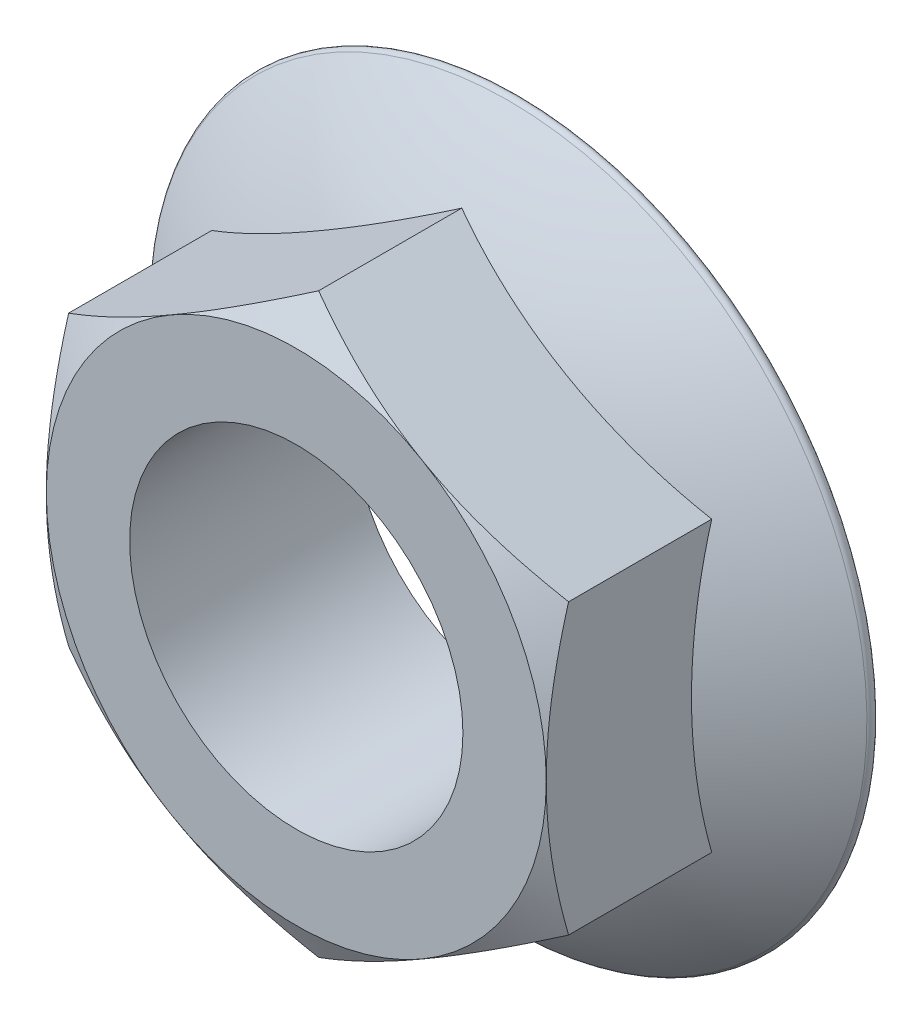
ISO-10303-21;
HEADER;
FILE_DESCRIPTION(('STEP AP214'),'2;1');
FILE_NAME('part.step','',(''),(''),'','','');
FILE_SCHEMA(('AUTOMOTIVE_DESIGN { 1 0 10303 214 1 1 1 1 }'));
ENDSEC;
DATA;
#1=APPLICATION_CONTEXT('core data for automotive mechanical design processes');
#2=APPLICATION_PROTOCOL_DEFINITION('international standard','automotive_design',2000,#1);
#3=PRODUCT_CONTEXT('',#1,'mechanical');
#4=PRODUCT('Part','Part','',(#3));
#5=PRODUCT_RELATED_PRODUCT_CATEGORY('part','',(#4));
#6=PRODUCT_DEFINITION_FORMATION('','',#4);
#7=PRODUCT_DEFINITION_CONTEXT('part definition',#1,'design');
#8=PRODUCT_DEFINITION('design','',#6,#7);
#9=PRODUCT_DEFINITION_SHAPE('','',#8);
#10=(LENGTH_UNIT() NAMED_UNIT(*) SI_UNIT(.MILLI.,.METRE.));
#11=(NAMED_UNIT(*) PLANE_ANGLE_UNIT() SI_UNIT($,.RADIAN.));
#12=(NAMED_UNIT(*) SI_UNIT($,.STERADIAN.) SOLID_ANGLE_UNIT());
#13=UNCERTAINTY_MEASURE_WITH_UNIT(LENGTH_MEASURE(1.E-05),#10,'distance_accuracy_value','');
#14=(GEOMETRIC_REPRESENTATION_CONTEXT(3) GLOBAL_UNCERTAINTY_ASSIGNED_CONTEXT((#13)) GLOBAL_UNIT_ASSIGNED_CONTEXT((#10,
#11,#12)) REPRESENTATION_CONTEXT('',''));
#15=CARTESIAN_POINT('',(0.,0.,0.));
#16=DIRECTION('',(0.,0.,1.));
#17=DIRECTION('',(1.,0.,0.));
#18=AXIS2_PLACEMENT_3D('',#15,#16,#17);
#19=CARTESIAN_POINT('',(0.,25.9807621135332,20.));
#20=DIRECTION('',(0.5,-0.866025403784439,0.));
#21=DIRECTION('',(0.866025403784439,0.5,0.));
#22=AXIS2_PLACEMENT_3D('',#19,#20,#21);
#23=PLANE('',#22);
#24=CARTESIAN_POINT('',(0.000199999999998479,25.980877583587,17.9903143896555));
#25=CARTESIAN_POINT('',(-0.494340315320358,25.6953545994117,18.1551492707593));
#26=CARTESIAN_POINT('',(-0.990809601239479,25.4087179235419,18.3125041584607));
#27=CARTESIAN_POINT('',(-1.98772926208786,24.8331460889906,18.6101747825265));
#28=CARTESIAN_POINT('',(-2.48818088905229,24.5442102074463,18.7504849147612));
#29=CARTESIAN_POINT('',(-3.49404310444017,23.9634753866245,19.0121827394148));
#30=CARTESIAN_POINT('',(-3.99946257540048,23.6716713190119,19.1335252438812));
#31=CARTESIAN_POINT('',(-5.01379199131474,23.0860479576868,19.3546738156916));
#32=CARTESIAN_POINT('',(-5.52270158333677,22.7922288677397,19.4544820284597));
#33=CARTESIAN_POINT('',(-6.53100308542397,22.2100857240854,19.6283253044473));
#34=CARTESIAN_POINT('',(-7.03032020450329,21.9218048509739,19.7029352669185));
#35=CARTESIAN_POINT('',(-8.03124235456725,21.3439221781966,19.8280391846674));
#36=CARTESIAN_POINT('',(-8.53284742940407,21.0543203532127,19.8785326757383));
#37=CARTESIAN_POINT('',(-9.53690018234172,20.4746302260236,19.954128715289));
#38=CARTESIAN_POINT('',(-10.0393461451645,20.1845429141346,19.9792614354897));
#39=CARTESIAN_POINT('',(-11.0447017408546,19.6041005903316,20.0035954599864));
#40=CARTESIAN_POINT('',(-11.5476113589139,19.313745586967,20.0027975655861));
#41=CARTESIAN_POINT('',(-12.4878094832121,18.7709219468119,19.9770814657185));
#42=CARTESIAN_POINT('',(-12.9251649504396,18.5184146500766,19.9552991118006));
#43=CARTESIAN_POINT('',(-13.7988317564138,18.0140028844653,19.892536574804));
#44=CARTESIAN_POINT('',(-14.2351431100254,17.7620984070071,19.8515566666916));
#45=CARTESIAN_POINT('',(-15.1065604849226,17.2589853510337,19.7511092481865));
#46=CARTESIAN_POINT('',(-15.5416650558499,17.0077776098832,19.6916250199366));
#47=CARTESIAN_POINT('',(-16.4097908378745,16.5065649559409,19.5552217340813));
#48=CARTESIAN_POINT('',(-16.842812057791,16.2565600380572,19.4783027503465));
#49=CARTESIAN_POINT('',(-18.1573722886485,15.4975983349057,19.2194196562896));
#50=CARTESIAN_POINT('',(-19.0351763947766,14.9907978979369,19.011627893702));
#51=CARTESIAN_POINT('',(-20.3421885092524,14.2361941018102,18.6578721503226));
#52=CARTESIAN_POINT('',(-20.7758690162324,13.985808544363,18.5330695175296));
#53=CARTESIAN_POINT('',(-21.6402303188989,13.4867693135914,18.2708295210671));
#54=CARTESIAN_POINT('',(-22.0709119234591,13.2381151732635,18.1333957185273));
#55=CARTESIAN_POINT('',(-22.5002,12.9902655867127,17.9903143896555));
#56=B_SPLINE_CURVE_WITH_KNOTS('',3,(#24,#25,#26,#27,#28,#29,#30,#31,#32,#33,#34,#35,#36,#37,#38,
#39,#40,#41,#42,#43,#44,#45,#46,#47,#48,#49,#50,#51,#52,#53,#54,#55),.UNSPECIFIED.,.F.,.F.,(4,2,
2,2,2,2,2,2,2,2,2,2,2,2,2,4),(0.,1.78312722203929,3.56683913913434,5.35473780165091,
7.14245825659312,8.88609109738608,10.6297574992032,12.3713470058018,14.1128826941264,
15.6289689473497,17.1450334863602,18.6624717220614,20.1799035285482,23.281607613878,
24.8297579454588,26.3774731352151),.UNSPECIFIED.);
#57=CARTESIAN_POINT('',(0.,25.9807621135332,17.9903810567666));
#58=VERTEX_POINT('',#57);
#59=CARTESIAN_POINT('',(-11.25,19.4855715851499,20.));
#60=VERTEX_POINT('',#59);
#61=EDGE_CURVE('E108',#58,#60,#56,.T.);
#62=ORIENTED_EDGE('',*,*,#61,.F.);
#63=DIRECTION('',(0.,0.,-1.));
#64=VECTOR('',#63,1.);
#65=CARTESIAN_POINT('',(0.,25.9807621135332,20.));
#66=LINE('',#65,#64);
#67=CARTESIAN_POINT('',(0.,25.9807621135332,5.10562126709525));
#68=VERTEX_POINT('',#67);
#69=EDGE_CURVE('E398',#58,#68,#66,.T.);
#70=ORIENTED_EDGE('',*,*,#69,.T.);
#71=CARTESIAN_POINT('',(-11.25,19.4855715851499,-40.4001136363637));
#72=DIRECTION('',(0.5,-0.866025403784439,0.));
#73=DIRECTION('',(0.866025403784439,0.5,0.));
#74=AXIS2_PLACEMENT_3D('',#71,#72,#73);
#75=CIRCLE('',#74,47.3235872383305);
#76=CARTESIAN_POINT('',(-22.5,12.9903810567666,5.10562126709525));
#77=VERTEX_POINT('',#76);
#78=EDGE_CURVE('E396',#77,#68,#75,.F.);
#79=ORIENTED_EDGE('',*,*,#78,.F.);
#80=DIRECTION('',(0.,0.,-1.));
#81=VECTOR('',#80,1.);
#82=CARTESIAN_POINT('',(-22.5,12.9903810567666,20.));
#83=LINE('',#82,#81);
#84=CARTESIAN_POINT('',(-22.5,12.9903810567666,17.9903810567666));
#85=VERTEX_POINT('',#84);
#86=EDGE_CURVE('E131',#85,#77,#83,.T.);
#87=ORIENTED_EDGE('',*,*,#86,.F.);
#88=EDGE_CURVE('E117',#60,#85,#56,.T.);
#89=ORIENTED_EDGE('',*,*,#88,.F.);
#90=EDGE_LOOP('',(#62,#70,#79,#87,#89));
#91=FACE_BOUND('',#90,.T.);
#92=ADVANCED_FACE('F38',(#91),#23,.F.);
#93=CARTESIAN_POINT('',(-22.5,12.9903810567666,20.));
#94=DIRECTION('',(1.,0.,0.));
#95=DIRECTION('',(0.,0.,-1.));
#96=AXIS2_PLACEMENT_3D('',#93,#94,#95);
#97=PLANE('',#96);
#98=CARTESIAN_POINT('',(-22.5,42.937910116955,5.00279973211657));
#99=CARTESIAN_POINT('',(-22.5,42.4349867908762,5.25998830996277));
#100=CARTESIAN_POINT('',(-22.5,41.9316712448641,5.51640961946833));
#101=CARTESIAN_POINT('',(-22.5,40.9241808993457,6.02756274502809));
#102=CARTESIAN_POINT('',(-22.5,40.4200060968718,6.28229455523246));
#103=CARTESIAN_POINT('',(-22.5,38.906067399752,7.04372989587429));
#104=CARTESIAN_POINT('',(-22.5,37.8949075563432,7.54766394292194));
#105=CARTESIAN_POINT('',(-22.5,35.8664336922577,8.54744404798992));
#106=CARTESIAN_POINT('',(-22.5,34.849112085713,9.04327473279686));
#107=CARTESIAN_POINT('',(-22.5,32.8091562949487,10.0239453406089));
#108=CARTESIAN_POINT('',(-22.5,31.7865220333206,10.5087851029147));
#109=CARTESIAN_POINT('',(-22.5,29.6826836887022,11.489168716423));
#110=CARTESIAN_POINT('',(-22.5,28.6011475492797,11.9840015357758));
#111=CARTESIAN_POINT('',(-22.5,26.4295684611349,12.9545883452375));
#112=CARTESIAN_POINT('',(-22.5,25.3395259663007,13.4303433451106));
#113=CARTESIAN_POINT('',(-22.5,23.6970388665296,14.1254074700941));
#114=CARTESIAN_POINT('',(-22.5,23.1484886270678,14.3539282550564));
#115=CARTESIAN_POINT('',(-22.5,22.0485270558716,14.8039685587357));
#116=CARTESIAN_POINT('',(-22.5,21.4971157654287,15.0254881781701));
#117=CARTESIAN_POINT('',(-22.5,20.3909977243873,15.4606074265542));
#118=CARTESIAN_POINT('',(-22.5,19.8362901159974,15.6742048789127));
#119=CARTESIAN_POINT('',(-22.5,18.7234476974617,16.0922649956442));
#120=CARTESIAN_POINT('',(-22.5,18.1653129401696,16.2967278004915));
#121=CARTESIAN_POINT('',(-22.5,16.9449865841485,16.7309016542748));
#122=CARTESIAN_POINT('',(-22.5,16.2820662225517,16.9585738291773));
#123=CARTESIAN_POINT('',(-22.5,14.9505731173334,17.3968937659042));
#124=CARTESIAN_POINT('',(-22.5,14.2820001805723,17.6075409433931));
#125=CARTESIAN_POINT('',(-22.5,12.9391673365046,18.0088123953236));
#126=CARTESIAN_POINT('',(-22.5,12.2649101120209,18.1994456005083));
#127=CARTESIAN_POINT('',(-22.5,10.9102777489049,18.557528643239));
#128=CARTESIAN_POINT('',(-22.5,10.2299030383091,18.7249800895596));
#129=CARTESIAN_POINT('',(-22.5,8.87571641326103,19.0303528579027));
#130=CARTESIAN_POINT('',(-22.5,8.20201537871787,19.1687624656118));
#131=CARTESIAN_POINT('',(-22.5,6.84925952001053,19.4164959045111));
#132=CARTESIAN_POINT('',(-22.5,6.17020484117956,19.5258205224797));
#133=CARTESIAN_POINT('',(-22.5,4.80795712220681,19.7122164762278));
#134=CARTESIAN_POINT('',(-22.5,4.12476611922574,19.7893025566878));
#135=CARTESIAN_POINT('',(-22.5,2.75533096919537,19.9087926707029));
#136=CARTESIAN_POINT('',(-22.5,2.06908684258476,19.9511969360801));
#137=CARTESIAN_POINT('',(-22.5,0.687324246378009,20.0001091636126));
#138=CARTESIAN_POINT('',(-22.5,-0.00820938704599076,20.0061945929854));
#139=CARTESIAN_POINT('',(-22.5,-1.39859832033206,19.9811125243047));
#140=CARTESIAN_POINT('',(-22.5,-2.09345361787946,19.9499448995746));
#141=CARTESIAN_POINT('',(-22.5,-3.48080015469794,19.8514850050863));
#142=CARTESIAN_POINT('',(-22.5,-4.17329054677868,19.7841809279115));
#143=CARTESIAN_POINT('',(-22.5,-5.55411755952297,19.6157455550603));
#144=CARTESIAN_POINT('',(-22.5,-6.24245408545502,19.5146134908613));
#145=CARTESIAN_POINT('',(-22.5,-7.62722706977453,19.2793387973371));
#146=CARTESIAN_POINT('',(-22.5,-8.32355984305463,19.1445910821305));
#147=CARTESIAN_POINT('',(-22.5,-9.71010675509669,18.846809177478));
#148=CARTESIAN_POINT('',(-22.5,-10.4003208338406,18.6837747108902));
#149=CARTESIAN_POINT('',(-22.5,-11.7745189775227,18.3330815856482));
#150=CARTESIAN_POINT('',(-22.5,-12.4585022055107,18.1454196696198));
#151=CARTESIAN_POINT('',(-22.5,-13.8202809477323,17.7489421717333));
#152=CARTESIAN_POINT('',(-22.5,-14.4980764221405,17.5401264538304));
#153=CARTESIAN_POINT('',(-22.5,-15.7921426442065,17.122402240074));
#154=CARTESIAN_POINT('',(-22.5,-16.408876911634,16.9149219806037));
#155=CARTESIAN_POINT('',(-22.5,-17.6377869149722,16.4868319747096));
#156=CARTESIAN_POINT('',(-22.5,-18.2499624656504,16.2662216980187));
#157=CARTESIAN_POINT('',(-22.5,-19.4702017344588,15.8136516015775));
#158=CARTESIAN_POINT('',(-22.5,-20.0782647898368,15.5816899998701));
#159=CARTESIAN_POINT('',(-22.5,-21.2905575041822,15.1079993142826));
#160=CARTESIAN_POINT('',(-22.5,-21.8947872099299,14.8662703498649));
#161=CARTESIAN_POINT('',(-22.5,-23.1003484017779,14.3741314470397));
#162=CARTESIAN_POINT('',(-22.5,-23.7016766801851,14.1237136653835));
#163=CARTESIAN_POINT('',(-22.5,-24.9012239962781,13.6155267116629));
#164=CARTESIAN_POINT('',(-22.5,-25.4994429898334,13.3577574355927));
#165=CARTESIAN_POINT('',(-22.5,-26.6930217519426,12.8358485601786));
#166=CARTESIAN_POINT('',(-22.5,-27.2883817976791,12.5717095939821));
#167=CARTESIAN_POINT('',(-22.5,-28.4765906338492,12.0378380893407));
#168=CARTESIAN_POINT('',(-22.5,-29.0694394044817,11.7681055068895));
#169=CARTESIAN_POINT('',(-22.5,-30.7817709336552,10.9804762057214));
#170=CARTESIAN_POINT('',(-22.5,-31.8983456673484,10.4562536555283));
#171=CARTESIAN_POINT('',(-22.5,-34.124920581488,9.39399908091056));
#172=CARTESIAN_POINT('',(-22.5,-35.2349205776655,8.8559666716726));
#173=CARTESIAN_POINT('',(-22.5,-37.4463300983147,7.77041638266379));
#174=CARTESIAN_POINT('',(-22.5,-38.5477551094307,7.22293001683052));
#175=CARTESIAN_POINT('',(-22.5,-40.1964930693805,6.39505102381711));
#176=CARTESIAN_POINT('',(-22.5,-40.745485226106,6.11799365715499));
#177=CARTESIAN_POINT('',(-22.5,-41.8424430578517,5.56186024348551));
#178=CARTESIAN_POINT('',(-22.5,-42.3904087376387,5.28278420588176));
#179=CARTESIAN_POINT('',(-22.5,-42.937910116955,5.00279973211658));
#180=B_SPLINE_CURVE_WITH_KNOTS('',3,(#98,#99,#100,#101,#102,#103,#104,#105,#106,#107,#108,#109,
#110,#111,#112,#113,#114,#115,#116,#117,#118,#119,#120,#121,#122,#123,#124,#125,#126,#127,#128,
#129,#130,#131,#132,#133,#134,#135,#136,#137,#138,#139,#140,#141,#142,#143,#144,#145,#146,#147,
#148,#149,#150,#151,#152,#153,#154,#155,#156,#157,#158,#159,#160,#161,#162,#163,#164,#165,#166,
#167,#168,#169,#170,#171,#172,#173,#174,#175,#176,#177,#178,#179),.UNSPECIFIED.,.F.,.F.,(4,2,2,
2,2,2,2,2,2,2,2,2,2,2,2,2,2,2,2,2,2,2,2,2,2,2,2,2,2,2,2,2,2,2,2,2,2,2,2,2,4),(0.,
1.69460800721615,3.3892218788855,6.77851144025748,10.1736205822667,13.5687793325238,
17.1367290228506,20.7044896163155,22.4871908668035,24.2698664600163,26.0530282634379,
27.83616263562,29.9387425585486,32.0413946160485,34.1431043928186,36.2446682413239,
38.307417211311,40.3701103761814,42.431859109237,44.4935940609252,46.579269162215,
48.6649513557284,50.7513154512245,52.8377269490867,54.9648116511539,57.0919171946992,
59.2193043660852,61.3467052200283,63.2986367527605,65.250647169518,67.2029650065895,
69.1552589725683,71.1093635950016,73.0634958770022,75.0174347123851,76.9713889257113,
80.6717851506885,84.3722845998144,88.0622051563254,89.9070267613382,91.7518397781164),.UNSPECIFIED.);
#181=CARTESIAN_POINT('',(-22.5,0.,20.));
#182=VERTEX_POINT('',#181);
#183=EDGE_CURVE('E123',#85,#182,#180,.T.);
#184=ORIENTED_EDGE('',*,*,#183,.F.);
#185=ORIENTED_EDGE('',*,*,#86,.T.);
#186=CARTESIAN_POINT('',(-22.5,0.,-40.4001136363637));
#187=DIRECTION('',(1.,0.,0.));
#188=DIRECTION('',(0.,0.,-1.));
#189=AXIS2_PLACEMENT_3D('',#186,#187,#188);
#190=CIRCLE('',#189,47.3235872383305);
#191=CARTESIAN_POINT('',(-22.5,-12.9903810567666,5.10562126709523));
#192=VERTEX_POINT('',#191);
#193=EDGE_CURVE('E395',#192,#77,#190,.F.);
#194=ORIENTED_EDGE('',*,*,#193,.F.);
#195=DIRECTION('',(0.,0.,-1.));
#196=VECTOR('',#195,1.);
#197=CARTESIAN_POINT('',(-22.5,-12.9903810567666,20.));
#198=LINE('',#197,#196);
#199=CARTESIAN_POINT('',(-22.5,-12.9903810567666,17.9903810567666));
#200=VERTEX_POINT('',#199);
#201=EDGE_CURVE('E203',#200,#192,#198,.T.);
#202=ORIENTED_EDGE('',*,*,#201,.F.);
#203=EDGE_CURVE('E132',#182,#200,#180,.T.);
#204=ORIENTED_EDGE('',*,*,#203,.F.);
#205=EDGE_LOOP('',(#184,#185,#194,#202,#204));
#206=FACE_BOUND('',#205,.T.);
#207=ADVANCED_FACE('F192',(#206),#97,.F.);
#208=CARTESIAN_POINT('',(-22.5,-12.9903810567666,20.));
#209=DIRECTION('',(0.5,0.866025403784439,0.));
#210=DIRECTION('',(-0.866025403784439,0.5,0.));
#211=AXIS2_PLACEMENT_3D('',#208,#209,#210);
#212=PLANE('',#211);
#213=CARTESIAN_POINT('',(-22.5002,-12.9902655867127,17.9903143896555));
#214=CARTESIAN_POINT('',(-22.0056596846796,-13.2757885708881,18.1551492707593));
#215=CARTESIAN_POINT('',(-21.5091903987605,-13.5624252467579,18.3125041584607));
#216=CARTESIAN_POINT('',(-20.5122707379121,-14.1379970813091,18.6101747825265));
#217=CARTESIAN_POINT('',(-20.0118191109477,-14.4269329628534,18.7504849147612));
#218=CARTESIAN_POINT('',(-19.0059568955598,-15.0076677836753,19.0121827394149));
#219=CARTESIAN_POINT('',(-18.5005374245995,-15.2994718512879,19.1335252438812));
#220=CARTESIAN_POINT('',(-17.4862080086853,-15.8850952126129,19.3546738156916));
#221=CARTESIAN_POINT('',(-16.9772984166632,-16.17891430256,19.4544820284597));
#222=CARTESIAN_POINT('',(-15.968996914576,-16.7610574462144,19.6283253044473));
#223=CARTESIAN_POINT('',(-15.4696797954967,-17.0493383193258,19.7029352669185));
#224=CARTESIAN_POINT('',(-14.4687576454327,-17.6272209921031,19.8280391846674));
#225=CARTESIAN_POINT('',(-13.9671525705959,-17.916822817087,19.8785326757383));
#226=CARTESIAN_POINT('',(-12.9630998176583,-18.4965129442762,19.954128715289));
#227=CARTESIAN_POINT('',(-12.4606538548355,-18.7866002561651,19.9792614354897));
#228=CARTESIAN_POINT('',(-11.4552982591454,-19.3670425799681,20.0035954599864));
#229=CARTESIAN_POINT('',(-10.9523886410861,-19.6573975833327,20.0027975655861));
#230=CARTESIAN_POINT('',(-10.0121905167879,-20.2002212234878,19.9770814657185));
#231=CARTESIAN_POINT('',(-9.57483504956041,-20.4527285202232,19.9552991118006));
#232=CARTESIAN_POINT('',(-8.70116824358617,-20.9571402858345,19.892536574804));
#233=CARTESIAN_POINT('',(-8.26485688997455,-21.2090447632926,19.8515566666916));
#234=CARTESIAN_POINT('',(-7.39343951507734,-21.712157819266,19.7511092481865));
#235=CARTESIAN_POINT('',(-6.95833494415013,-21.9633655604165,19.6916250199366));
#236=CARTESIAN_POINT('',(-6.09020916212552,-22.4645782143589,19.5552217340813));
#237=CARTESIAN_POINT('',(-5.65718794220897,-22.7145831322425,19.4783027503465));
#238=CARTESIAN_POINT('',(-4.3426277113515,-23.473544835394,19.2194196562896));
#239=CARTESIAN_POINT('',(-3.4648236052234,-23.9803452723629,19.011627893702));
#240=CARTESIAN_POINT('',(-2.15781149074757,-24.7349490684896,18.6578721503226));
#241=CARTESIAN_POINT('',(-1.72413098376757,-24.9853346259368,18.5330695175296));
#242=CARTESIAN_POINT('',(-0.859769681101037,-25.4843738567084,18.2708295210671));
#243=CARTESIAN_POINT('',(-0.429088076540852,-25.7330279970362,18.1333957185273));
#244=CARTESIAN_POINT('',(0.000200000000030924,-25.980877583587,17.9903143896555));
#245=B_SPLINE_CURVE_WITH_KNOTS('',3,(#213,#214,#215,#216,#217,#218,#219,#220,#221,#222,#223,
#224,#225,#226,#227,#228,#229,#230,#231,#232,#233,#234,#235,#236,#237,#238,#239,#240,#241,#242,
#243,#244),.UNSPECIFIED.,.F.,.F.,(4,2,2,2,2,2,2,2,2,2,2,2,2,2,2,4),(0.,1.78312722203929,
3.56683913913434,5.35473780165092,7.14245825659312,8.88609109738608,10.6297574992032,
12.3713470058018,14.1128826941264,15.6289689473497,17.1450334863602,18.6624717220614,
20.1799035285482,23.281607613878,24.8297579454588,26.3774731352151),.UNSPECIFIED.);
#246=CARTESIAN_POINT('',(-11.25,-19.4855715851499,20.));
#247=VERTEX_POINT('',#246);
#248=EDGE_CURVE('E186',#200,#247,#245,.T.);
#249=ORIENTED_EDGE('',*,*,#248,.F.);
#250=ORIENTED_EDGE('',*,*,#201,.T.);
#251=CARTESIAN_POINT('',(-11.25,-19.4855715851499,-40.4001136363637));
#252=DIRECTION('',(0.5,0.866025403784439,0.));
#253=DIRECTION('',(-0.866025403784439,0.5,0.));
#254=AXIS2_PLACEMENT_3D('',#251,#252,#253);
#255=CIRCLE('',#254,47.3235872383305);
#256=CARTESIAN_POINT('',(0.,-25.9807621135332,5.10562126709523));
#257=VERTEX_POINT('',#256);
#258=EDGE_CURVE('E220',#257,#192,#255,.F.);
#259=ORIENTED_EDGE('',*,*,#258,.F.);
#260=DIRECTION('',(0.,0.,-1.));
#261=VECTOR('',#260,1.);
#262=CARTESIAN_POINT('',(0.,-25.9807621135332,20.));
#263=LINE('',#262,#261);
#264=CARTESIAN_POINT('',(0.,-25.9807621135332,17.9903810567666));
#265=VERTEX_POINT('',#264);
#266=EDGE_CURVE('E218',#265,#257,#263,.T.);
#267=ORIENTED_EDGE('',*,*,#266,.F.);
#268=EDGE_CURVE('E180',#247,#265,#245,.T.);
#269=ORIENTED_EDGE('',*,*,#268,.F.);
#270=EDGE_LOOP('',(#249,#250,#259,#267,#269));
#271=FACE_BOUND('',#270,.T.);
#272=ADVANCED_FACE('F188',(#271),#212,.F.);
#273=CARTESIAN_POINT('',(0.,-25.9807621135332,20.));
#274=DIRECTION('',(-0.5,0.866025403784439,0.));
#275=DIRECTION('',(-0.866025403784439,-0.5,0.));
#276=AXIS2_PLACEMENT_3D('',#273,#274,#275);
#277=PLANE('',#276);
#278=CARTESIAN_POINT('',(-0.000199999999971291,-25.980877583587,17.9903143896555));
#279=CARTESIAN_POINT('',(0.494340315320384,-25.6953545994117,18.1551492707593));
#280=CARTESIAN_POINT('',(0.990809601239505,-25.4087179235419,18.3125041584607));
#281=CARTESIAN_POINT('',(1.98772926208789,-24.8331460889906,18.6101747825265));
#282=CARTESIAN_POINT('',(2.48818088905232,-24.5442102074463,18.7504849147612));
#283=CARTESIAN_POINT('',(3.4940431044402,-23.9634753866245,19.0121827394148));
#284=CARTESIAN_POINT('',(3.99946257540051,-23.6716713190119,19.1335252438812));
#285=CARTESIAN_POINT('',(5.01379199131477,-23.0860479576868,19.3546738156916));
#286=CARTESIAN_POINT('',(5.5227015833368,-22.7922288677397,19.4544820284597));
#287=CARTESIAN_POINT('',(6.531003085424,-22.2100857240854,19.6283253044473));
#288=CARTESIAN_POINT('',(7.03032020450333,-21.9218048509739,19.7029352669185));
#289=CARTESIAN_POINT('',(8.03124235456728,-21.3439221781966,19.8280391846674));
#290=CARTESIAN_POINT('',(8.5328474294041,-21.0543203532127,19.8785326757383));
#291=CARTESIAN_POINT('',(9.53690018234176,-20.4746302260236,19.954128715289));
#292=CARTESIAN_POINT('',(10.0393461451645,-20.1845429141346,19.9792614354897));
#293=CARTESIAN_POINT('',(11.0447017408547,-19.6041005903316,20.0035954599864));
#294=CARTESIAN_POINT('',(11.5476113589139,-19.313745586967,20.0027975655861));
#295=CARTESIAN_POINT('',(12.4878094832121,-18.7709219468119,19.9770814657185));
#296=CARTESIAN_POINT('',(12.9251649504396,-18.5184146500766,19.9552991118006));
#297=CARTESIAN_POINT('',(13.7988317564138,-18.0140028844653,19.892536574804));
#298=CARTESIAN_POINT('',(14.2351431100255,-17.7620984070071,19.8515566666916));
#299=CARTESIAN_POINT('',(15.1065604849227,-17.2589853510337,19.7511092481864));
#300=CARTESIAN_POINT('',(15.5416650558499,-17.0077776098833,19.6916250199365));
#301=CARTESIAN_POINT('',(16.4097908378745,-16.5065649559409,19.5552217340813));
#302=CARTESIAN_POINT('',(16.842812057791,-16.2565600380573,19.4783027503465));
#303=CARTESIAN_POINT('',(18.1573722886485,-15.4975983349057,19.2194196562896));
#304=CARTESIAN_POINT('',(19.0351763947766,-14.9907978979369,19.011627893702));
#305=CARTESIAN_POINT('',(20.3421885092524,-14.2361941018102,18.6578721503226));
#306=CARTESIAN_POINT('',(20.7758690162324,-13.985808544363,18.5330695175296));
#307=CARTESIAN_POINT('',(21.6402303188989,-13.4867693135914,18.2708295210671));
#308=CARTESIAN_POINT('',(22.0709119234591,-13.2381151732635,18.1333957185272));
#309=CARTESIAN_POINT('',(22.5002,-12.9902655867128,17.9903143896555));
#310=B_SPLINE_CURVE_WITH_KNOTS('',3,(#278,#279,#280,#281,#282,#283,#284,#285,#286,#287,#288,
#289,#290,#291,#292,#293,#294,#295,#296,#297,#298,#299,#300,#301,#302,#303,#304,#305,#306,#307,
#308,#309),.UNSPECIFIED.,.F.,.F.,(4,2,2,2,2,2,2,2,2,2,2,2,2,2,2,4),(0.,1.78312722203929,
3.56683913913434,5.35473780165092,7.14245825659312,8.88609109738608,10.6297574992032,
12.3713470058018,14.1128826941264,15.6289689473497,17.1450334863602,18.6624717220614,
20.1799035285482,23.2816076138779,24.8297579454588,26.377473135215),.UNSPECIFIED.);
#311=CARTESIAN_POINT('',(11.25,-19.4855715851499,20.));
#312=VERTEX_POINT('',#311);
#313=EDGE_CURVE('E187',#265,#312,#310,.T.);
#314=ORIENTED_EDGE('',*,*,#313,.F.);
#315=ORIENTED_EDGE('',*,*,#266,.T.);
#316=CARTESIAN_POINT('',(11.25,-19.4855715851499,-40.4001136363637));
#317=DIRECTION('',(-0.5,0.866025403784439,0.));
#318=DIRECTION('',(-0.866025403784439,-0.5,0.));
#319=AXIS2_PLACEMENT_3D('',#316,#317,#318);
#320=CIRCLE('',#319,47.3235872383305);
#321=CARTESIAN_POINT('',(22.5,-12.9903810567666,5.10562126709523));
#322=VERTEX_POINT('',#321);
#323=EDGE_CURVE('E400',#322,#257,#320,.F.);
#324=ORIENTED_EDGE('',*,*,#323,.F.);
#325=DIRECTION('',(0.,0.,-1.));
#326=VECTOR('',#325,1.);
#327=CARTESIAN_POINT('',(22.5,-12.9903810567666,20.));
#328=LINE('',#327,#326);
#329=CARTESIAN_POINT('',(22.5,-12.9903810567666,17.9903810567666));
#330=VERTEX_POINT('',#329);
#331=EDGE_CURVE('E224',#330,#322,#328,.T.);
#332=ORIENTED_EDGE('',*,*,#331,.F.);
#333=EDGE_CURVE('E174',#312,#330,#310,.T.);
#334=ORIENTED_EDGE('',*,*,#333,.F.);
#335=EDGE_LOOP('',(#314,#315,#324,#332,#334));
#336=FACE_BOUND('',#335,.T.);
#337=ADVANCED_FACE('F191',(#336),#277,.F.);
#338=CARTESIAN_POINT('',(22.5,-12.9903810567666,20.));
#339=DIRECTION('',(-1.,0.,0.));
#340=DIRECTION('',(0.,-1.,0.));
#341=AXIS2_PLACEMENT_3D('',#338,#339,#340);
#342=PLANE('',#341);
#343=CARTESIAN_POINT('',(22.5,-42.937910116955,5.00279973211656));
#344=CARTESIAN_POINT('',(22.5,-42.4349867908762,5.25998830996275));
#345=CARTESIAN_POINT('',(22.5,-41.9316712448641,5.51640961946831));
#346=CARTESIAN_POINT('',(22.5,-40.9241808993457,6.02756274502807));
#347=CARTESIAN_POINT('',(22.5,-40.4200060968718,6.28229455523245));
#348=CARTESIAN_POINT('',(22.5,-38.906067399752,7.04372989587427));
#349=CARTESIAN_POINT('',(22.5,-37.8949075563432,7.54766394292192));
#350=CARTESIAN_POINT('',(22.5,-35.8664336922577,8.54744404798991));
#351=CARTESIAN_POINT('',(22.5,-34.849112085713,9.04327473279685));
#352=CARTESIAN_POINT('',(22.5,-32.8091562949487,10.0239453406089));
#353=CARTESIAN_POINT('',(22.5,-31.7865220333206,10.5087851029147));
#354=CARTESIAN_POINT('',(22.5,-29.6826836887023,11.489168716423));
#355=CARTESIAN_POINT('',(22.5,-28.6011475492797,11.9840015357758));
#356=CARTESIAN_POINT('',(22.5,-26.4295684611349,12.9545883452375));
#357=CARTESIAN_POINT('',(22.5,-25.3395259663007,13.4303433451106));
#358=CARTESIAN_POINT('',(22.5,-23.6970388665296,14.1254074700941));
#359=CARTESIAN_POINT('',(22.5,-23.1484886270678,14.3539282550564));
#360=CARTESIAN_POINT('',(22.5,-22.0485270558716,14.8039685587357));
#361=CARTESIAN_POINT('',(22.5,-21.4971157654287,15.0254881781701));
#362=CARTESIAN_POINT('',(22.5,-20.3909977243873,15.4606074265542));
#363=CARTESIAN_POINT('',(22.5,-19.8362901159974,15.6742048789127));
#364=CARTESIAN_POINT('',(22.5,-18.7234476974617,16.0922649956442));
#365=CARTESIAN_POINT('',(22.5,-18.1653129401696,16.2967278004915));
#366=CARTESIAN_POINT('',(22.5,-16.9449865841485,16.7309016542748));
#367=CARTESIAN_POINT('',(22.5,-16.2820662225517,16.9585738291773));
#368=CARTESIAN_POINT('',(22.5,-14.9505731173334,17.3968937659042));
#369=CARTESIAN_POINT('',(22.5,-14.2820001805723,17.6075409433931));
#370=CARTESIAN_POINT('',(22.5,-12.9391673365046,18.0088123953236));
#371=CARTESIAN_POINT('',(22.5,-12.2649101120209,18.1994456005083));
#372=CARTESIAN_POINT('',(22.5,-10.9102777489049,18.557528643239));
#373=CARTESIAN_POINT('',(22.5,-10.2299030383092,18.7249800895596));
#374=CARTESIAN_POINT('',(22.5,-8.87571641326104,19.0303528579027));
#375=CARTESIAN_POINT('',(22.5,-8.20201537871788,19.1687624656118));
#376=CARTESIAN_POINT('',(22.5,-6.84925952001054,19.4164959045111));
#377=CARTESIAN_POINT('',(22.5,-6.17020484117957,19.5258205224797));
#378=CARTESIAN_POINT('',(22.5,-4.80795712220682,19.7122164762278));
#379=CARTESIAN_POINT('',(22.5,-4.12476611922574,19.7893025566878));
#380=CARTESIAN_POINT('',(22.5,-2.75533096919537,19.9087926707029));
#381=CARTESIAN_POINT('',(22.5,-2.06908684258476,19.9511969360801));
#382=CARTESIAN_POINT('',(22.5,-0.687324246378011,20.0001091636126));
#383=CARTESIAN_POINT('',(22.5,0.00820938704598892,20.0061945929854));
#384=CARTESIAN_POINT('',(22.5,1.39859832033206,19.9811125243047));
#385=CARTESIAN_POINT('',(22.5,2.09345361787946,19.9499448995746));
#386=CARTESIAN_POINT('',(22.5,3.48080015469794,19.8514850050863));
#387=CARTESIAN_POINT('',(22.5,4.17329054677868,19.7841809279115));
#388=CARTESIAN_POINT('',(22.5,5.55411755952297,19.6157455550603));
#389=CARTESIAN_POINT('',(22.5,6.24245408545502,19.5146134908613));
#390=CARTESIAN_POINT('',(22.5,7.62722706977453,19.2793387973371));
#391=CARTESIAN_POINT('',(22.5,8.32355984305463,19.1445910821305));
#392=CARTESIAN_POINT('',(22.5,9.71010675509669,18.846809177478));
#393=CARTESIAN_POINT('',(22.5,10.4003208338406,18.6837747108902));
#394=CARTESIAN_POINT('',(22.5,11.7745189775227,18.3330815856482));
#395=CARTESIAN_POINT('',(22.5,12.4585022055107,18.1454196696198));
#396=CARTESIAN_POINT('',(22.5,13.8202809477323,17.7489421717333));
#397=CARTESIAN_POINT('',(22.5,14.4980764221405,17.5401264538304));
#398=CARTESIAN_POINT('',(22.5,15.7921426442065,17.122402240074));
#399=CARTESIAN_POINT('',(22.5,16.408876911634,16.9149219806036));
#400=CARTESIAN_POINT('',(22.5,17.6377869149722,16.4868319747096));
#401=CARTESIAN_POINT('',(22.5,18.2499624656504,16.2662216980187));
#402=CARTESIAN_POINT('',(22.5,19.4702017344588,15.8136516015775));
#403=CARTESIAN_POINT('',(22.5,20.0782647898368,15.5816899998701));
#404=CARTESIAN_POINT('',(22.5,21.2905575041822,15.1079993142826));
#405=CARTESIAN_POINT('',(22.5,21.8947872099299,14.8662703498649));
#406=CARTESIAN_POINT('',(22.5,23.1003484017779,14.3741314470397));
#407=CARTESIAN_POINT('',(22.5,23.7016766801851,14.1237136653835));
#408=CARTESIAN_POINT('',(22.5,24.9012239962781,13.6155267116629));
#409=CARTESIAN_POINT('',(22.5,25.4994429898335,13.3577574355927));
#410=CARTESIAN_POINT('',(22.5,26.6930217519427,12.8358485601786));
#411=CARTESIAN_POINT('',(22.5,27.2883817976792,12.5717095939821));
#412=CARTESIAN_POINT('',(22.5,28.4765906338492,12.0378380893406));
#413=CARTESIAN_POINT('',(22.5,29.0694394044818,11.7681055068895));
#414=CARTESIAN_POINT('',(22.5,30.7817709336552,10.9804762057214));
#415=CARTESIAN_POINT('',(22.5,31.8983456673485,10.4562536555283));
#416=CARTESIAN_POINT('',(22.5,34.1249205814881,9.39399908091054));
#417=CARTESIAN_POINT('',(22.5,35.2349205776655,8.85596667167258));
#418=CARTESIAN_POINT('',(22.5,37.4463300983147,7.77041638266377));
#419=CARTESIAN_POINT('',(22.5,38.5477551094308,7.22293001683049));
#420=CARTESIAN_POINT('',(22.5,40.1964930693805,6.39505102381709));
#421=CARTESIAN_POINT('',(22.5,40.745485226106,6.11799365715497));
#422=CARTESIAN_POINT('',(22.5,41.8424430578518,5.56186024348549));
#423=CARTESIAN_POINT('',(22.5,42.3904087376387,5.28278420588174));
#424=CARTESIAN_POINT('',(22.5,42.937910116955,5.00279973211656));
#425=B_SPLINE_CURVE_WITH_KNOTS('',3,(#343,#344,#345,#346,#347,#348,#349,#350,#351,#352,#353,
#354,#355,#356,#357,#358,#359,#360,#361,#362,#363,#364,#365,#366,#367,#368,#369,#370,#371,#372,
#373,#374,#375,#376,#377,#378,#379,#380,#381,#382,#383,#384,#385,#386,#387,#388,#389,#390,#391,
#392,#393,#394,#395,#396,#397,#398,#399,#400,#401,#402,#403,#404,#405,#406,#407,#408,#409,#410,
#411,#412,#413,#414,#415,#416,#417,#418,#419,#420,#421,#422,#423,#424),.UNSPECIFIED.,.F.,.F.,(4,
2,2,2,2,2,2,2,2,2,2,2,2,2,2,2,2,2,2,2,2,2,2,2,2,2,2,2,2,2,2,2,2,2,2,2,2,2,2,2,4),(0.,
1.69460800721614,3.3892218788855,6.77851144025748,10.1736205822667,13.5687793325238,
17.1367290228506,20.7044896163155,22.4871908668035,24.2698664600163,26.0530282634379,
27.83616263562,29.9387425585486,32.0413946160485,34.1431043928186,36.244668241324,
38.307417211311,40.3701103761815,42.431859109237,44.4935940609253,46.5792691622151,
48.6649513557284,50.7513154512246,52.8377269490868,54.9648116511539,57.0919171946992,
59.2193043660852,61.3467052200284,63.2986367527605,65.250647169518,67.2029650065896,
69.1552589725684,71.1093635950017,73.0634958770023,75.0174347123852,76.9713889257114,
80.6717851506887,84.3722845998145,88.0622051563255,89.9070267613383,91.7518397781165),.UNSPECIFIED.);
#426=CARTESIAN_POINT('',(22.5,0.,20.));
#427=VERTEX_POINT('',#426);
#428=EDGE_CURVE('E243',#330,#427,#425,.T.);
#429=ORIENTED_EDGE('',*,*,#428,.F.);
#430=ORIENTED_EDGE('',*,*,#331,.T.);
#431=CARTESIAN_POINT('',(22.5,0.,-40.4001136363637));
#432=DIRECTION('',(-1.,0.,0.));
#433=DIRECTION('',(0.,-1.,0.));
#434=AXIS2_PLACEMENT_3D('',#431,#432,#433);
#435=CIRCLE('',#434,47.3235872383305);
#436=CARTESIAN_POINT('',(22.5,12.9903810567666,5.10562126709525));
#437=VERTEX_POINT('',#436);
#438=EDGE_CURVE('E404',#437,#322,#435,.F.);
#439=ORIENTED_EDGE('',*,*,#438,.F.);
#440=DIRECTION('',(0.,0.,-1.));
#441=VECTOR('',#440,1.);
#442=CARTESIAN_POINT('',(22.5,12.9903810567666,20.));
#443=LINE('',#442,#441);
#444=CARTESIAN_POINT('',(22.5,12.9903810567666,17.9903810567666));
#445=VERTEX_POINT('',#444);
#446=EDGE_CURVE('E227',#445,#437,#443,.T.);
#447=ORIENTED_EDGE('',*,*,#446,.F.);
#448=EDGE_CURVE('E167',#427,#445,#425,.T.);
#449=ORIENTED_EDGE('',*,*,#448,.F.);
#450=EDGE_LOOP('',(#429,#430,#439,#447,#449));
#451=FACE_BOUND('',#450,.T.);
#452=ADVANCED_FACE('F242',(#451),#342,.F.);
#453=CARTESIAN_POINT('',(22.5,12.9903810567666,20.));
#454=DIRECTION('',(-0.5,-0.866025403784439,0.));
#455=DIRECTION('',(0.866025403784439,-0.5,0.));
#456=AXIS2_PLACEMENT_3D('',#453,#454,#455);
#457=PLANE('',#456);
#458=CARTESIAN_POINT('',(22.5002,12.9902655867127,17.9903143896555));
#459=CARTESIAN_POINT('',(22.0056596846796,13.2757885708881,18.1551492707593));
#460=CARTESIAN_POINT('',(21.5091903987605,13.5624252467579,18.3125041584607));
#461=CARTESIAN_POINT('',(20.5122707379121,14.1379970813091,18.6101747825265));
#462=CARTESIAN_POINT('',(20.0118191109477,14.4269329628534,18.7504849147612));
#463=CARTESIAN_POINT('',(19.0059568955598,15.0076677836753,19.0121827394148));
#464=CARTESIAN_POINT('',(18.5005374245995,15.2994718512879,19.1335252438812));
#465=CARTESIAN_POINT('',(17.4862080086853,15.8850952126129,19.3546738156916));
#466=CARTESIAN_POINT('',(16.9772984166632,16.17891430256,19.4544820284597));
#467=CARTESIAN_POINT('',(15.968996914576,16.7610574462144,19.6283253044473));
#468=CARTESIAN_POINT('',(15.4696797954967,17.0493383193258,19.7029352669185));
#469=CARTESIAN_POINT('',(14.4687576454328,17.6272209921031,19.8280391846674));
#470=CARTESIAN_POINT('',(13.9671525705959,17.916822817087,19.8785326757383));
#471=CARTESIAN_POINT('',(12.9630998176583,18.4965129442762,19.954128715289));
#472=CARTESIAN_POINT('',(12.4606538548355,18.7866002561651,19.9792614354897));
#473=CARTESIAN_POINT('',(11.4552982591454,19.3670425799681,20.0035954599864));
#474=CARTESIAN_POINT('',(10.9523886410861,19.6573975833327,20.0027975655861));
#475=CARTESIAN_POINT('',(10.0121905167879,20.2002212234879,19.9770814657185));
#476=CARTESIAN_POINT('',(9.57483504956042,20.4527285202232,19.9552991118006));
#477=CARTESIAN_POINT('',(8.70116824358618,20.9571402858345,19.892536574804));
#478=CARTESIAN_POINT('',(8.26485688997456,21.2090447632926,19.8515566666916));
#479=CARTESIAN_POINT('',(7.39343951507735,21.712157819266,19.7511092481865));
#480=CARTESIAN_POINT('',(6.95833494415015,21.9633655604165,19.6916250199366));
#481=CARTESIAN_POINT('',(6.09020916212554,22.4645782143589,19.5552217340813));
#482=CARTESIAN_POINT('',(5.65718794220899,22.7145831322425,19.4783027503465));
#483=CARTESIAN_POINT('',(4.34262771135152,23.473544835394,19.2194196562896));
#484=CARTESIAN_POINT('',(3.46482360522342,23.9803452723629,19.011627893702));
#485=CARTESIAN_POINT('',(2.15781149074759,24.7349490684896,18.6578721503226));
#486=CARTESIAN_POINT('',(1.72413098376759,24.9853346259368,18.5330695175296));
#487=CARTESIAN_POINT('',(0.859769681101065,25.4843738567084,18.2708295210671));
#488=CARTESIAN_POINT('',(0.429088076540881,25.7330279970362,18.1333957185273));
#489=CARTESIAN_POINT('',(-0.000200000000000763,25.980877583587,17.9903143896555));
#490=B_SPLINE_CURVE_WITH_KNOTS('',3,(#458,#459,#460,#461,#462,#463,#464,#465,#466,#467,#468,
#469,#470,#471,#472,#473,#474,#475,#476,#477,#478,#479,#480,#481,#482,#483,#484,#485,#486,#487,
#488,#489),.UNSPECIFIED.,.F.,.F.,(4,2,2,2,2,2,2,2,2,2,2,2,2,2,2,4),(0.,1.78312722203929,
3.56683913913434,5.35473780165092,7.14245825659312,8.88609109738608,10.6297574992032,
12.3713470058018,14.1128826941264,15.6289689473497,17.1450334863602,18.6624717220614,
20.1799035285482,23.281607613878,24.8297579454588,26.3774731352151),.UNSPECIFIED.);
#491=CARTESIAN_POINT('',(11.25,19.4855715851499,20.));
#492=VERTEX_POINT('',#491);
#493=EDGE_CURVE('E247',#445,#492,#490,.T.);
#494=ORIENTED_EDGE('',*,*,#493,.F.);
#495=ORIENTED_EDGE('',*,*,#446,.T.);
#496=CARTESIAN_POINT('',(11.25,19.4855715851499,-40.4001136363637));
#497=DIRECTION('',(-0.5,-0.866025403784439,0.));
#498=DIRECTION('',(0.866025403784439,-0.5,0.));
#499=AXIS2_PLACEMENT_3D('',#496,#497,#498);
#500=CIRCLE('',#499,47.3235872383305);
#501=EDGE_CURVE('E231',#68,#437,#500,.F.);
#502=ORIENTED_EDGE('',*,*,#501,.F.);
#503=ORIENTED_EDGE('',*,*,#69,.F.);
#504=EDGE_CURVE('E112',#492,#58,#490,.T.);
#505=ORIENTED_EDGE('',*,*,#504,.F.);
#506=EDGE_LOOP('',(#494,#495,#502,#503,#505));
#507=FACE_BOUND('',#506,.T.);
#508=ADVANCED_FACE('F270',(#507),#457,.F.);
#509=CARTESIAN_POINT('',(0.,0.,-40.4001136363637));
#510=DIRECTION('',(0.,0.,-1.));
#511=DIRECTION('',(0.,1.,0.));
#512=AXIS2_PLACEMENT_3D('',#509,#510,#511);
#513=SPHERICAL_SURFACE('',#512,52.4001136363642);
#514=CARTESIAN_POINT('',(0.,0.,0.894027206982344));
#515=DIRECTION('',(0.,0.,-1.));
#516=DIRECTION('',(0.,1.,0.));
#517=AXIS2_PLACEMENT_3D('',#514,#515,#516);
#518=CIRCLE('',#517,32.2578027942664);
#519=CARTESIAN_POINT('',(0.,32.2578027942664,0.894027206982347));
#520=VERTEX_POINT('',#519);
#521=EDGE_CURVE('E393',#520,#520,#518,.T.);
#522=ORIENTED_EDGE('',*,*,#521,.F.);
#523=EDGE_LOOP('',(#522));
#524=FACE_BOUND('',#523,.T.);
#525=ORIENTED_EDGE('',*,*,#193,.T.);
#526=ORIENTED_EDGE('',*,*,#78,.T.);
#527=ORIENTED_EDGE('',*,*,#501,.T.);
#528=ORIENTED_EDGE('',*,*,#438,.T.);
#529=ORIENTED_EDGE('',*,*,#323,.T.);
#530=ORIENTED_EDGE('',*,*,#258,.T.);
#531=EDGE_LOOP('',(#525,#526,#527,#528,#529,#530));
#532=FACE_BOUND('',#531,.T.);
#533=ADVANCED_FACE('F266',(#524,#532),#513,.T.);
#534=CARTESIAN_POINT('',(0.,0.,0.500000000000004));
#535=DIRECTION('',(0.,0.,-1.));
#536=DIRECTION('',(0.,1.,0.));
#537=AXIS2_PLACEMENT_3D('',#534,#535,#536);
#538=TOROIDAL_SURFACE('',#537,31.95,0.500000000000504);
#539=CARTESIAN_POINT('',(0.,0.,-5.00024423247987E-13));
#540=DIRECTION('',(0.,0.,-1.));
#541=DIRECTION('',(0.,1.,0.));
#542=AXIS2_PLACEMENT_3D('',#539,#540,#541);
#543=CIRCLE('',#542,31.95);
#544=CARTESIAN_POINT('',(0.,31.95,-4.96111676724711E-13));
#545=VERTEX_POINT('',#544);
#546=EDGE_CURVE('E116',#545,#545,#543,.T.);
#547=ORIENTED_EDGE('',*,*,#546,.F.);
#548=EDGE_LOOP('',(#547));
#549=FACE_BOUND('',#548,.T.);
#550=ORIENTED_EDGE('',*,*,#521,.T.);
#551=EDGE_LOOP('',(#550));
#552=FACE_BOUND('',#551,.T.);
#553=ADVANCED_FACE('F152',(#549,#552),#538,.T.);
#554=CARTESIAN_POINT('',(0.,0.,0.));
#555=DIRECTION('',(0.,0.,1.));
#556=DIRECTION('',(1.,0.,0.));
#557=AXIS2_PLACEMENT_3D('',#554,#555,#556);
#558=PLANE('',#557);
#559=CARTESIAN_POINT('',(0.,0.,-4.96130914129367E-13));
#560=DIRECTION('',(0.,0.,1.));
#561=DIRECTION('',(1.,0.,0.));
#562=AXIS2_PLACEMENT_3D('',#559,#560,#561);
#563=CIRCLE('',#562,15.);
#564=CARTESIAN_POINT('',(15.,0.,-4.96130914129367E-13));
#565=VERTEX_POINT('',#564);
#566=EDGE_CURVE('E248',#565,#565,#563,.T.);
#567=ORIENTED_EDGE('',*,*,#566,.T.);
#568=EDGE_LOOP('',(#567));
#569=FACE_BOUND('',#568,.T.);
#570=ORIENTED_EDGE('',*,*,#546,.T.);
#571=EDGE_LOOP('',(#570));
#572=FACE_BOUND('',#571,.T.);
#573=ADVANCED_FACE('F267',(#569,#572),#558,.F.);
#574=CARTESIAN_POINT('',(0.,0.,20.));
#575=DIRECTION('',(0.,0.,-1.));
#576=DIRECTION('',(1.,0.,0.));
#577=AXIS2_PLACEMENT_3D('',#574,#575,#576);
#578=CONICAL_SURFACE('',#577,22.5,1.0471975511966);
#579=ORIENTED_EDGE('',*,*,#333,.T.);
#580=ORIENTED_EDGE('',*,*,#428,.T.);
#581=CARTESIAN_POINT('',(0.,0.,20.));
#582=DIRECTION('',(0.,0.,1.));
#583=DIRECTION('',(1.,0.,0.));
#584=AXIS2_PLACEMENT_3D('',#581,#582,#583);
#585=CIRCLE('',#584,22.5);
#586=EDGE_CURVE('E42',#312,#427,#585,.T.);
#587=ORIENTED_EDGE('',*,*,#586,.F.);
#588=EDGE_LOOP('',(#579,#580,#587));
#589=FACE_BOUND('',#588,.T.);
#590=ADVANCED_FACE('F264',(#589),#578,.T.);
#591=ORIENTED_EDGE('',*,*,#268,.T.);
#592=ORIENTED_EDGE('',*,*,#313,.T.);
#593=EDGE_CURVE('E211',#247,#312,#585,.T.);
#594=ORIENTED_EDGE('',*,*,#593,.F.);
#595=EDGE_LOOP('',(#591,#592,#594));
#596=FACE_BOUND('',#595,.T.);
#597=ADVANCED_FACE('F212',(#596),#578,.T.);
#598=ORIENTED_EDGE('',*,*,#203,.T.);
#599=ORIENTED_EDGE('',*,*,#248,.T.);
#600=EDGE_CURVE('E127',#182,#247,#585,.T.);
#601=ORIENTED_EDGE('',*,*,#600,.F.);
#602=EDGE_LOOP('',(#598,#599,#601));
#603=FACE_BOUND('',#602,.T.);
#604=ADVANCED_FACE('F207',(#603),#578,.T.);
#605=ORIENTED_EDGE('',*,*,#88,.T.);
#606=ORIENTED_EDGE('',*,*,#183,.T.);
#607=EDGE_CURVE('E47',#60,#182,#585,.T.);
#608=ORIENTED_EDGE('',*,*,#607,.F.);
#609=EDGE_LOOP('',(#605,#606,#608));
#610=FACE_BOUND('',#609,.T.);
#611=ADVANCED_FACE('F121',(#610),#578,.T.);
#612=ORIENTED_EDGE('',*,*,#61,.T.);
#613=EDGE_CURVE('E12',#492,#60,#585,.T.);
#614=ORIENTED_EDGE('',*,*,#613,.F.);
#615=ORIENTED_EDGE('',*,*,#504,.T.);
#616=EDGE_LOOP('',(#612,#614,#615));
#617=FACE_BOUND('',#616,.T.);
#618=ADVANCED_FACE('F110',(#617),#578,.T.);
#619=ORIENTED_EDGE('',*,*,#448,.T.);
#620=ORIENTED_EDGE('',*,*,#493,.T.);
#621=CARTESIAN_POINT('',(0.,0.,20.));
#622=DIRECTION('',(0.,0.,1.));
#623=DIRECTION('',(1.,0.,0.));
#624=AXIS2_PLACEMENT_3D('',#621,#622,#623);
#625=CIRCLE('',#624,22.5);
#626=EDGE_CURVE('E54',#427,#492,#625,.T.);
#627=ORIENTED_EDGE('',*,*,#626,.F.);
#628=EDGE_LOOP('',(#619,#620,#627));
#629=FACE_BOUND('',#628,.T.);
#630=ADVANCED_FACE('F150',(#629),#578,.T.);
#631=CARTESIAN_POINT('',(0.,0.,20.));
#632=DIRECTION('',(0.,0.,1.));
#633=DIRECTION('',(1.,0.,0.));
#634=AXIS2_PLACEMENT_3D('',#631,#632,#633);
#635=PLANE('',#634);
#636=CARTESIAN_POINT('',(0.,0.,20.));
#637=DIRECTION('',(0.,0.,1.));
#638=DIRECTION('',(1.,0.,0.));
#639=AXIS2_PLACEMENT_3D('',#636,#637,#638);
#640=CIRCLE('',#639,15.);
#641=CARTESIAN_POINT('',(15.,0.,20.));
#642=VERTEX_POINT('',#641);
#643=EDGE_CURVE('E250',#642,#642,#640,.T.);
#644=ORIENTED_EDGE('',*,*,#643,.F.);
#645=EDGE_LOOP('',(#644));
#646=FACE_BOUND('',#645,.T.);
#647=ORIENTED_EDGE('',*,*,#586,.T.);
#648=ORIENTED_EDGE('',*,*,#626,.T.);
#649=ORIENTED_EDGE('',*,*,#613,.T.);
#650=ORIENTED_EDGE('',*,*,#607,.T.);
#651=ORIENTED_EDGE('',*,*,#600,.T.);
#652=ORIENTED_EDGE('',*,*,#593,.T.);
#653=EDGE_LOOP('',(#647,#648,#649,#650,#651,#652));
#654=FACE_BOUND('',#653,.T.);
#655=ADVANCED_FACE('F128',(#646,#654),#635,.T.);
#656=CARTESIAN_POINT('',(0.,0.,-4.96130914129367E-13));
#657=DIRECTION('',(0.,0.,1.));
#658=DIRECTION('',(1.,0.,0.));
#659=AXIS2_PLACEMENT_3D('',#656,#657,#658);
#660=CYLINDRICAL_SURFACE('',#659,15.);
#661=ORIENTED_EDGE('',*,*,#566,.F.);
#662=EDGE_LOOP('',(#661));
#663=FACE_BOUND('',#662,.T.);
#664=ORIENTED_EDGE('',*,*,#643,.T.);
#665=EDGE_LOOP('',(#664));
#666=FACE_BOUND('',#665,.T.);
#667=ADVANCED_FACE('F151',(#663,#666),#660,.F.);
#668=CLOSED_SHELL('',(#92,#207,#272,#337,#452,#508,#533,#553,#573,#590,#597,#604,#611,#618,#630,
#655,#667));
#669=MANIFOLD_SOLID_BREP('B2',#668);
#670=ADVANCED_BREP_SHAPE_REPRESENTATION('',(#18,#669),#14);
#671=SHAPE_DEFINITION_REPRESENTATION(#9,#670);
ENDSEC;
END-ISO-10303-21;
